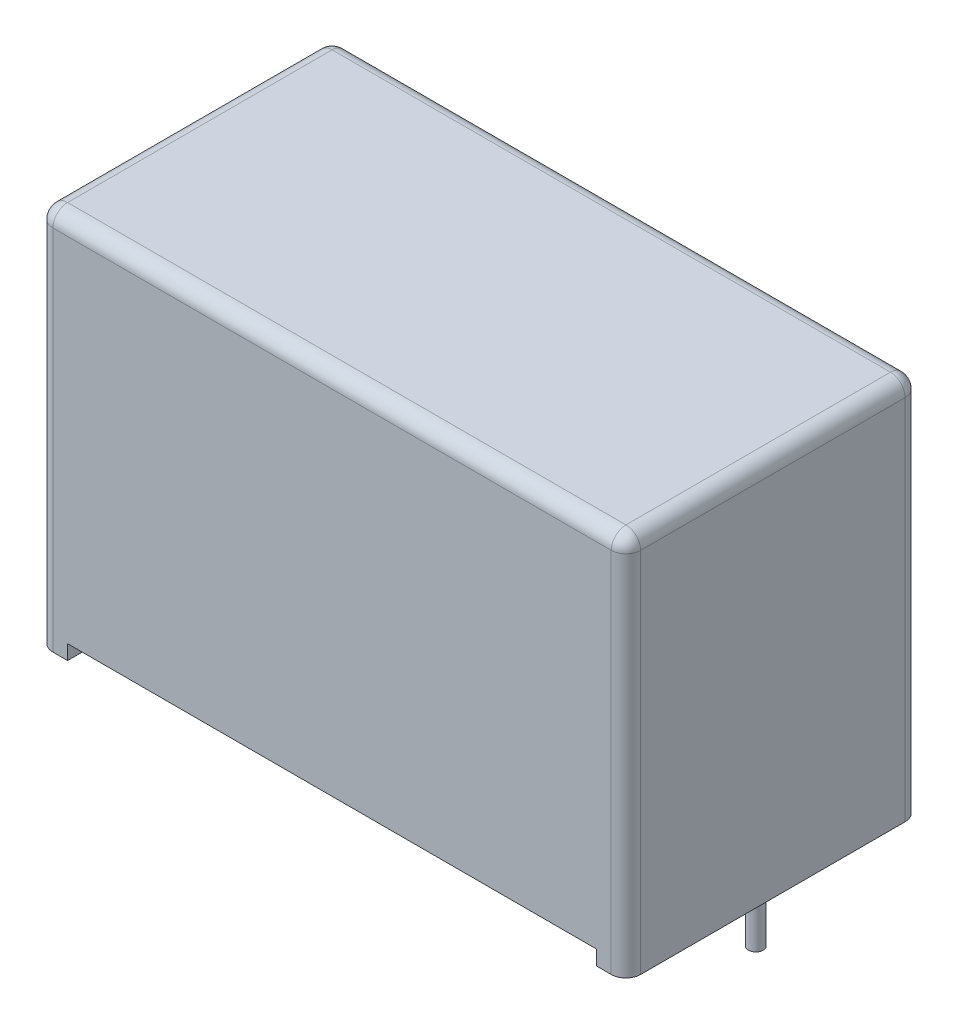
ISO-10303-21;
HEADER;
FILE_DESCRIPTION(('STEP AP214'),'2;1');
FILE_NAME('part.step','',(''),(''),'','','');
FILE_SCHEMA(('AUTOMOTIVE_DESIGN { 1 0 10303 214 1 1 1 1 }'));
ENDSEC;
DATA;
#1=APPLICATION_CONTEXT('core data for automotive mechanical design processes');
#2=APPLICATION_PROTOCOL_DEFINITION('international standard','automotive_design',2000,#1);
#3=PRODUCT_CONTEXT('',#1,'mechanical');
#4=PRODUCT('Part','Part','',(#3));
#5=PRODUCT_RELATED_PRODUCT_CATEGORY('part','',(#4));
#6=PRODUCT_DEFINITION_FORMATION('','',#4);
#7=PRODUCT_DEFINITION_CONTEXT('part definition',#1,'design');
#8=PRODUCT_DEFINITION('design','',#6,#7);
#9=PRODUCT_DEFINITION_SHAPE('','',#8);
#10=(LENGTH_UNIT() NAMED_UNIT(*) SI_UNIT(.MILLI.,.METRE.));
#11=(NAMED_UNIT(*) PLANE_ANGLE_UNIT() SI_UNIT($,.RADIAN.));
#12=(NAMED_UNIT(*) SI_UNIT($,.STERADIAN.) SOLID_ANGLE_UNIT());
#13=UNCERTAINTY_MEASURE_WITH_UNIT(LENGTH_MEASURE(1.E-05),#10,'distance_accuracy_value','');
#14=(GEOMETRIC_REPRESENTATION_CONTEXT(3) GLOBAL_UNCERTAINTY_ASSIGNED_CONTEXT((#13)) GLOBAL_UNIT_ASSIGNED_CONTEXT((#10,
#11,#12)) REPRESENTATION_CONTEXT('',''));
#15=CARTESIAN_POINT('',(0.,0.,0.));
#16=DIRECTION('',(0.,0.,1.));
#17=DIRECTION('',(1.,0.,0.));
#18=AXIS2_PLACEMENT_3D('',#15,#16,#17);
#19=CARTESIAN_POINT('',(2.539999850988,-3.5,-1.800000074506));
#20=DIRECTION('',(0.,-1.,0.));
#21=DIRECTION('',(0.,0.,-1.));
#22=AXIS2_PLACEMENT_3D('',#19,#20,#21);
#23=PLANE('',#22);
#24=CARTESIAN_POINT('',(2.539999850988,-3.5,-1.800000074506));
#25=DIRECTION('',(0.,-1.,0.));
#26=DIRECTION('',(0.,0.,-1.));
#27=AXIS2_PLACEMENT_3D('',#24,#25,#26);
#28=CIRCLE('',#27,0.25);
#29=CARTESIAN_POINT('',(2.539999850988,-3.5,-2.050000074506));
#30=VERTEX_POINT('',#29);
#31=EDGE_CURVE('P0_E18',#30,#30,#28,.F.);
#32=ORIENTED_EDGE('',*,*,#31,.F.);
#33=EDGE_LOOP('',(#32));
#34=FACE_BOUND('',#33,.T.);
#35=ADVANCED_FACE('P0_F15',(#34),#23,.T.);
#36=CARTESIAN_POINT('',(2.539999850988,0.5,-1.800000074506));
#37=DIRECTION('',(0.,-1.,0.));
#38=DIRECTION('',(0.,0.,-1.));
#39=AXIS2_PLACEMENT_3D('',#36,#37,#38);
#40=PLANE('',#39);
#41=CARTESIAN_POINT('',(2.539999850988,0.5,-1.800000074506));
#42=DIRECTION('',(0.,-1.,0.));
#43=DIRECTION('',(0.,0.,-1.));
#44=AXIS2_PLACEMENT_3D('',#41,#42,#43);
#45=CIRCLE('',#44,0.25);
#46=CARTESIAN_POINT('',(2.539999850988,0.5,-2.050000074506));
#47=VERTEX_POINT('',#46);
#48=EDGE_CURVE('P0_E10',#47,#47,#45,.T.);
#49=ORIENTED_EDGE('',*,*,#48,.F.);
#50=EDGE_LOOP('',(#49));
#51=FACE_BOUND('',#50,.T.);
#52=ADVANCED_FACE('P0_F30',(#51),#40,.F.);
#53=CARTESIAN_POINT('',(2.539999850988,0.5,-1.800000074506));
#54=DIRECTION('',(0.,-1.,0.));
#55=DIRECTION('',(0.,0.,-1.));
#56=AXIS2_PLACEMENT_3D('',#53,#54,#55);
#57=CYLINDRICAL_SURFACE('',#56,0.25);
#58=ORIENTED_EDGE('',*,*,#48,.T.);
#59=EDGE_LOOP('',(#58));
#60=FACE_BOUND('',#59,.T.);
#61=ORIENTED_EDGE('',*,*,#31,.T.);
#62=EDGE_LOOP('',(#61));
#63=FACE_BOUND('',#62,.T.);
#64=ADVANCED_FACE('P0_F27',(#60,#63),#57,.T.);
#65=CLOSED_SHELL('',(#35,#52,#64));
#66=MANIFOLD_SOLID_BREP('P0_B1',#65);
#67=CARTESIAN_POINT('',(-5.080000149012,-3.5,-1.800000074506));
#68=DIRECTION('',(0.,-1.,0.));
#69=DIRECTION('',(0.,0.,-1.));
#70=AXIS2_PLACEMENT_3D('',#67,#68,#69);
#71=PLANE('',#70);
#72=CARTESIAN_POINT('',(-5.080000149012,-3.5,-1.800000074506));
#73=DIRECTION('',(0.,-1.,0.));
#74=DIRECTION('',(0.,0.,-1.));
#75=AXIS2_PLACEMENT_3D('',#72,#73,#74);
#76=CIRCLE('',#75,0.25);
#77=CARTESIAN_POINT('',(-5.080000149012,-3.5,-2.050000074506));
#78=VERTEX_POINT('',#77);
#79=EDGE_CURVE('P1_E18',#78,#78,#76,.F.);
#80=ORIENTED_EDGE('',*,*,#79,.F.);
#81=EDGE_LOOP('',(#80));
#82=FACE_BOUND('',#81,.T.);
#83=ADVANCED_FACE('P1_F15',(#82),#71,.T.);
#84=CARTESIAN_POINT('',(-5.080000149012,0.5,-1.800000074506));
#85=DIRECTION('',(0.,-1.,0.));
#86=DIRECTION('',(0.,0.,-1.));
#87=AXIS2_PLACEMENT_3D('',#84,#85,#86);
#88=PLANE('',#87);
#89=CARTESIAN_POINT('',(-5.080000149012,0.5,-1.800000074506));
#90=DIRECTION('',(0.,-1.,0.));
#91=DIRECTION('',(0.,0.,-1.));
#92=AXIS2_PLACEMENT_3D('',#89,#90,#91);
#93=CIRCLE('',#92,0.25);
#94=CARTESIAN_POINT('',(-5.080000149012,0.5,-2.050000074506));
#95=VERTEX_POINT('',#94);
#96=EDGE_CURVE('P1_E10',#95,#95,#93,.T.);
#97=ORIENTED_EDGE('',*,*,#96,.F.);
#98=EDGE_LOOP('',(#97));
#99=FACE_BOUND('',#98,.T.);
#100=ADVANCED_FACE('P1_F30',(#99),#88,.F.);
#101=CARTESIAN_POINT('',(-5.080000149012,0.5,-1.800000074506));
#102=DIRECTION('',(0.,-1.,0.));
#103=DIRECTION('',(0.,0.,-1.));
#104=AXIS2_PLACEMENT_3D('',#101,#102,#103);
#105=CYLINDRICAL_SURFACE('',#104,0.25);
#106=ORIENTED_EDGE('',*,*,#96,.T.);
#107=EDGE_LOOP('',(#106));
#108=FACE_BOUND('',#107,.T.);
#109=ORIENTED_EDGE('',*,*,#79,.T.);
#110=EDGE_LOOP('',(#109));
#111=FACE_BOUND('',#110,.T.);
#112=ADVANCED_FACE('P1_F27',(#108,#111),#105,.T.);
#113=CLOSED_SHELL('',(#83,#100,#112));
#114=MANIFOLD_SOLID_BREP('P1_B1',#113);
#115=CARTESIAN_POINT('',(9.5,12.5,4.5));
#116=DIRECTION('',(0.577350269189626,0.577350269189626,0.577350269189626));
#117=DIRECTION('',(-0.707106781186548,0.,0.707106781186548));
#118=AXIS2_PLACEMENT_3D('',#115,#116,#117);
#119=SPHERICAL_SURFACE('',#118,0.5);
#120=CARTESIAN_POINT('',(9.78867513459481,12.7886751345948,4.78867513459481));
#121=VERTEX_POINT('',#120);
#122=VERTEX_LOOP('',#121);
#123=FACE_BOUND('',#122,.T.);
#124=CARTESIAN_POINT('',(9.5,12.5,4.5));
#125=DIRECTION('',(0.,1.,0.));
#126=DIRECTION('',(0.,0.,1.));
#127=AXIS2_PLACEMENT_3D('',#124,#125,#126);
#128=CIRCLE('',#127,0.5);
#129=CARTESIAN_POINT('',(10.,12.5,4.5));
#130=VERTEX_POINT('',#129);
#131=CARTESIAN_POINT('',(9.5,12.5,5.));
#132=VERTEX_POINT('',#131);
#133=EDGE_CURVE('P2_E146',#130,#132,#128,.F.);
#134=ORIENTED_EDGE('',*,*,#133,.F.);
#135=CARTESIAN_POINT('',(9.5,12.5,4.5));
#136=DIRECTION('',(0.,0.,-1.));
#137=DIRECTION('',(-1.,0.,0.));
#138=AXIS2_PLACEMENT_3D('',#135,#136,#137);
#139=CIRCLE('',#138,0.5);
#140=CARTESIAN_POINT('',(9.5,13.,4.5));
#141=VERTEX_POINT('',#140);
#142=EDGE_CURVE('P2_E136',#141,#130,#139,.T.);
#143=ORIENTED_EDGE('',*,*,#142,.F.);
#144=CARTESIAN_POINT('',(9.5,12.5,4.5));
#145=DIRECTION('',(1.,0.,0.));
#146=DIRECTION('',(0.,0.,-1.));
#147=AXIS2_PLACEMENT_3D('',#144,#145,#146);
#148=CIRCLE('',#147,0.5);
#149=EDGE_CURVE('P2_E298',#132,#141,#148,.F.);
#150=ORIENTED_EDGE('',*,*,#149,.F.);
#151=EDGE_LOOP('',(#134,#143,#150));
#152=FACE_BOUND('',#151,.T.);
#153=ADVANCED_FACE('P2_F17',(#123,#152),#119,.T.);
#154=CARTESIAN_POINT('',(-9.5,12.5,4.5));
#155=DIRECTION('',(-0.577350269189626,0.577350269189626,0.577350269189626));
#156=DIRECTION('',(-0.707106781186548,0.,-0.707106781186548));
#157=AXIS2_PLACEMENT_3D('',#154,#155,#156);
#158=SPHERICAL_SURFACE('',#157,0.5);
#159=CARTESIAN_POINT('',(-9.78867513459481,12.7886751345948,4.78867513459481));
#160=VERTEX_POINT('',#159);
#161=VERTEX_LOOP('',#160);
#162=FACE_BOUND('',#161,.T.);
#163=CARTESIAN_POINT('',(-9.5,12.5,4.5));
#164=DIRECTION('',(0.,1.,0.));
#165=DIRECTION('',(0.,0.,1.));
#166=AXIS2_PLACEMENT_3D('',#163,#164,#165);
#167=CIRCLE('',#166,0.5);
#168=CARTESIAN_POINT('',(-9.5,12.5,5.));
#169=VERTEX_POINT('',#168);
#170=CARTESIAN_POINT('',(-10.,12.5,4.5));
#171=VERTEX_POINT('',#170);
#172=EDGE_CURVE('P2_E129',#169,#171,#167,.F.);
#173=ORIENTED_EDGE('',*,*,#172,.F.);
#174=CARTESIAN_POINT('',(-9.5,12.5,4.5));
#175=DIRECTION('',(1.,0.,0.));
#176=DIRECTION('',(0.,0.,-1.));
#177=AXIS2_PLACEMENT_3D('',#174,#175,#176);
#178=CIRCLE('',#177,0.5);
#179=CARTESIAN_POINT('',(-9.5,13.,4.5));
#180=VERTEX_POINT('',#179);
#181=EDGE_CURVE('P2_E132',#180,#169,#178,.T.);
#182=ORIENTED_EDGE('',*,*,#181,.F.);
#183=CARTESIAN_POINT('',(-9.5,12.5,4.5));
#184=DIRECTION('',(0.,0.,1.));
#185=DIRECTION('',(1.,0.,0.));
#186=AXIS2_PLACEMENT_3D('',#183,#184,#185);
#187=CIRCLE('',#186,0.5);
#188=EDGE_CURVE('P2_E21',#171,#180,#187,.F.);
#189=ORIENTED_EDGE('',*,*,#188,.F.);
#190=EDGE_LOOP('',(#173,#182,#189));
#191=FACE_BOUND('',#190,.T.);
#192=ADVANCED_FACE('P2_F128',(#162,#191),#158,.T.);
#193=CARTESIAN_POINT('',(-9.5,12.5,-2.5));
#194=DIRECTION('',(0.,0.,1.));
#195=DIRECTION('',(1.,0.,0.));
#196=AXIS2_PLACEMENT_3D('',#193,#194,#195);
#197=CYLINDRICAL_SURFACE('',#196,0.5);
#198=CARTESIAN_POINT('',(-9.5,12.5,-4.5));
#199=DIRECTION('',(0.,0.,1.));
#200=DIRECTION('',(1.,0.,0.));
#201=AXIS2_PLACEMENT_3D('',#198,#199,#200);
#202=CIRCLE('',#201,0.5);
#203=CARTESIAN_POINT('',(-10.,12.5,-4.5));
#204=VERTEX_POINT('',#203);
#205=CARTESIAN_POINT('',(-9.5,13.,-4.5));
#206=VERTEX_POINT('',#205);
#207=EDGE_CURVE('P2_E153',#204,#206,#202,.F.);
#208=ORIENTED_EDGE('',*,*,#207,.F.);
#209=DIRECTION('',(0.,0.,1.));
#210=VECTOR('',#209,1.);
#211=CARTESIAN_POINT('',(-10.,12.5,-5.));
#212=LINE('',#211,#210);
#213=EDGE_CURVE('P2_E150',#171,#204,#212,.F.);
#214=ORIENTED_EDGE('',*,*,#213,.F.);
#215=ORIENTED_EDGE('',*,*,#188,.T.);
#216=DIRECTION('',(0.,0.,1.));
#217=VECTOR('',#216,1.);
#218=CARTESIAN_POINT('',(-9.5,13.,0.));
#219=LINE('',#218,#217);
#220=EDGE_CURVE('P2_E217',#206,#180,#219,.T.);
#221=ORIENTED_EDGE('',*,*,#220,.F.);
#222=EDGE_LOOP('',(#208,#214,#215,#221));
#223=FACE_BOUND('',#222,.T.);
#224=ADVANCED_FACE('P2_F151',(#223),#197,.T.);
#225=CARTESIAN_POINT('',(9.5,12.5,2.5));
#226=DIRECTION('',(0.,0.,-1.));
#227=DIRECTION('',(-1.,0.,0.));
#228=AXIS2_PLACEMENT_3D('',#225,#226,#227);
#229=CYLINDRICAL_SURFACE('',#228,0.5);
#230=ORIENTED_EDGE('',*,*,#142,.T.);
#231=DIRECTION('',(0.,0.,-1.));
#232=VECTOR('',#231,1.);
#233=CARTESIAN_POINT('',(10.,12.5,5.));
#234=LINE('',#233,#232);
#235=CARTESIAN_POINT('',(10.,12.5,-4.5));
#236=VERTEX_POINT('',#235);
#237=EDGE_CURVE('P2_E265',#236,#130,#234,.F.);
#238=ORIENTED_EDGE('',*,*,#237,.F.);
#239=CARTESIAN_POINT('',(9.5,12.5,-4.5));
#240=DIRECTION('',(0.,0.,-1.));
#241=DIRECTION('',(-1.,0.,0.));
#242=AXIS2_PLACEMENT_3D('',#239,#240,#241);
#243=CIRCLE('',#242,0.5);
#244=CARTESIAN_POINT('',(9.5,13.,-4.5));
#245=VERTEX_POINT('',#244);
#246=EDGE_CURVE('P2_E263',#245,#236,#243,.T.);
#247=ORIENTED_EDGE('',*,*,#246,.F.);
#248=DIRECTION('',(0.,0.,1.));
#249=VECTOR('',#248,1.);
#250=CARTESIAN_POINT('',(9.5,13.,0.));
#251=LINE('',#250,#249);
#252=EDGE_CURVE('P2_E282',#141,#245,#251,.F.);
#253=ORIENTED_EDGE('',*,*,#252,.F.);
#254=EDGE_LOOP('',(#230,#238,#247,#253));
#255=FACE_BOUND('',#254,.T.);
#256=ADVANCED_FACE('P2_F183',(#255),#229,.T.);
#257=CARTESIAN_POINT('',(0.,0.,0.));
#258=DIRECTION('',(0.,1.,0.));
#259=DIRECTION('',(0.,0.,1.));
#260=AXIS2_PLACEMENT_3D('',#257,#258,#259);
#261=PLANE('',#260);
#262=DIRECTION('',(0.,0.,1.));
#263=VECTOR('',#262,1.);
#264=CARTESIAN_POINT('',(-10.,0.,-5.));
#265=LINE('',#264,#263);
#266=CARTESIAN_POINT('',(-10.,0.,-4.5));
#267=VERTEX_POINT('',#266);
#268=CARTESIAN_POINT('',(-10.,0.,4.5));
#269=VERTEX_POINT('',#268);
#270=EDGE_CURVE('P2_E157',#267,#269,#265,.T.);
#271=ORIENTED_EDGE('',*,*,#270,.F.);
#272=CARTESIAN_POINT('',(-9.5,0.,-4.5));
#273=DIRECTION('',(0.,1.,0.));
#274=DIRECTION('',(0.,0.,1.));
#275=AXIS2_PLACEMENT_3D('',#272,#273,#274);
#276=CIRCLE('',#275,0.5);
#277=CARTESIAN_POINT('',(-9.5,0.,-5.));
#278=VERTEX_POINT('',#277);
#279=EDGE_CURVE('P2_E253',#278,#267,#276,.T.);
#280=ORIENTED_EDGE('',*,*,#279,.F.);
#281=DIRECTION('',(1.,0.,0.));
#282=VECTOR('',#281,1.);
#283=CARTESIAN_POINT('',(0.,0.,-5.));
#284=LINE('',#283,#282);
#285=CARTESIAN_POINT('',(-9.,0.,-5.));
#286=VERTEX_POINT('',#285);
#287=EDGE_CURVE('P2_E251',#286,#278,#284,.F.);
#288=ORIENTED_EDGE('',*,*,#287,.F.);
#289=DIRECTION('',(0.,0.,1.));
#290=VECTOR('',#289,1.);
#291=CARTESIAN_POINT('',(-9.,0.,-5.));
#292=LINE('',#291,#290);
#293=CARTESIAN_POINT('',(-9.,0.,5.));
#294=VERTEX_POINT('',#293);
#295=EDGE_CURVE('P2_E272',#286,#294,#292,.T.);
#296=ORIENTED_EDGE('',*,*,#295,.T.);
#297=DIRECTION('',(1.,0.,0.));
#298=VECTOR('',#297,1.);
#299=CARTESIAN_POINT('',(0.,0.,5.));
#300=LINE('',#299,#298);
#301=CARTESIAN_POINT('',(-9.5,0.,5.));
#302=VERTEX_POINT('',#301);
#303=EDGE_CURVE('P2_E254',#302,#294,#300,.T.);
#304=ORIENTED_EDGE('',*,*,#303,.F.);
#305=CARTESIAN_POINT('',(-9.5,0.,4.5));
#306=DIRECTION('',(0.,1.,0.));
#307=DIRECTION('',(0.,0.,1.));
#308=AXIS2_PLACEMENT_3D('',#305,#306,#307);
#309=CIRCLE('',#308,0.5);
#310=EDGE_CURVE('P2_E147',#269,#302,#309,.T.);
#311=ORIENTED_EDGE('',*,*,#310,.F.);
#312=EDGE_LOOP('',(#271,#280,#288,#296,#304,#311));
#313=FACE_BOUND('',#312,.T.);
#314=ADVANCED_FACE('P2_F186',(#313),#261,.F.);
#315=CARTESIAN_POINT('',(-9.5,0.,4.5));
#316=DIRECTION('',(0.,1.,0.));
#317=DIRECTION('',(0.,0.,1.));
#318=AXIS2_PLACEMENT_3D('',#315,#316,#317);
#319=CYLINDRICAL_SURFACE('',#318,0.5);
#320=ORIENTED_EDGE('',*,*,#172,.T.);
#321=DIRECTION('',(0.,1.,0.));
#322=VECTOR('',#321,1.);
#323=CARTESIAN_POINT('',(-10.,0.,4.5));
#324=LINE('',#323,#322);
#325=EDGE_CURVE('P2_E142',#269,#171,#324,.T.);
#326=ORIENTED_EDGE('',*,*,#325,.F.);
#327=ORIENTED_EDGE('',*,*,#310,.T.);
#328=DIRECTION('',(0.,1.,0.));
#329=VECTOR('',#328,1.);
#330=CARTESIAN_POINT('',(-9.5,0.,5.));
#331=LINE('',#330,#329);
#332=EDGE_CURVE('P2_E145',#169,#302,#331,.F.);
#333=ORIENTED_EDGE('',*,*,#332,.F.);
#334=EDGE_LOOP('',(#320,#326,#327,#333));
#335=FACE_BOUND('',#334,.T.);
#336=ADVANCED_FACE('P2_F139',(#335),#319,.T.);
#337=CARTESIAN_POINT('',(9.5,0.,4.5));
#338=DIRECTION('',(0.,1.,0.));
#339=DIRECTION('',(0.,0.,1.));
#340=AXIS2_PLACEMENT_3D('',#337,#338,#339);
#341=CYLINDRICAL_SURFACE('',#340,0.5);
#342=ORIENTED_EDGE('',*,*,#133,.T.);
#343=DIRECTION('',(0.,1.,0.));
#344=VECTOR('',#343,1.);
#345=CARTESIAN_POINT('',(9.5,0.,5.));
#346=LINE('',#345,#344);
#347=CARTESIAN_POINT('',(9.5,0.,5.));
#348=VERTEX_POINT('',#347);
#349=EDGE_CURVE('P2_E234',#348,#132,#346,.T.);
#350=ORIENTED_EDGE('',*,*,#349,.F.);
#351=CARTESIAN_POINT('',(9.5,0.,4.5));
#352=DIRECTION('',(0.,1.,0.));
#353=DIRECTION('',(0.,0.,1.));
#354=AXIS2_PLACEMENT_3D('',#351,#352,#353);
#355=CIRCLE('',#354,0.5);
#356=CARTESIAN_POINT('',(10.,0.,4.5));
#357=VERTEX_POINT('',#356);
#358=EDGE_CURVE('P2_E161',#348,#357,#355,.T.);
#359=ORIENTED_EDGE('',*,*,#358,.T.);
#360=DIRECTION('',(0.,1.,0.));
#361=VECTOR('',#360,1.);
#362=CARTESIAN_POINT('',(10.,0.,4.5));
#363=LINE('',#362,#361);
#364=EDGE_CURVE('P2_E260',#130,#357,#363,.F.);
#365=ORIENTED_EDGE('',*,*,#364,.F.);
#366=EDGE_LOOP('',(#342,#350,#359,#365));
#367=FACE_BOUND('',#366,.T.);
#368=ADVANCED_FACE('P2_F193',(#367),#341,.T.);
#369=CARTESIAN_POINT('',(-5.,12.5,4.5));
#370=DIRECTION('',(1.,0.,0.));
#371=DIRECTION('',(0.,0.,-1.));
#372=AXIS2_PLACEMENT_3D('',#369,#370,#371);
#373=CYLINDRICAL_SURFACE('',#372,0.5);
#374=ORIENTED_EDGE('',*,*,#181,.T.);
#375=DIRECTION('',(1.,0.,0.));
#376=VECTOR('',#375,1.);
#377=CARTESIAN_POINT('',(-10.,12.5,5.));
#378=LINE('',#377,#376);
#379=EDGE_CURVE('P2_E172',#132,#169,#378,.F.);
#380=ORIENTED_EDGE('',*,*,#379,.F.);
#381=ORIENTED_EDGE('',*,*,#149,.T.);
#382=DIRECTION('',(1.,0.,0.));
#383=VECTOR('',#382,1.);
#384=CARTESIAN_POINT('',(0.,13.,4.5));
#385=LINE('',#384,#383);
#386=EDGE_CURVE('P2_E167',#180,#141,#385,.T.);
#387=ORIENTED_EDGE('',*,*,#386,.F.);
#388=EDGE_LOOP('',(#374,#380,#381,#387));
#389=FACE_BOUND('',#388,.T.);
#390=ADVANCED_FACE('P2_F196',(#389),#373,.T.);
#391=CARTESIAN_POINT('',(0.,0.,0.));
#392=DIRECTION('',(0.,1.,0.));
#393=DIRECTION('',(0.,0.,1.));
#394=AXIS2_PLACEMENT_3D('',#391,#392,#393);
#395=PLANE('',#394);
#396=DIRECTION('',(1.,0.,0.));
#397=VECTOR('',#396,1.);
#398=CARTESIAN_POINT('',(-10.,0.,5.));
#399=LINE('',#398,#397);
#400=CARTESIAN_POINT('',(9.,0.,5.));
#401=VERTEX_POINT('',#400);
#402=EDGE_CURVE('P2_E237',#401,#348,#399,.T.);
#403=ORIENTED_EDGE('',*,*,#402,.F.);
#404=DIRECTION('',(0.,0.,-1.));
#405=VECTOR('',#404,1.);
#406=CARTESIAN_POINT('',(9.,0.,5.));
#407=LINE('',#406,#405);
#408=CARTESIAN_POINT('',(9.,0.,-5.));
#409=VERTEX_POINT('',#408);
#410=EDGE_CURVE('P2_E227',#401,#409,#407,.T.);
#411=ORIENTED_EDGE('',*,*,#410,.T.);
#412=DIRECTION('',(1.,0.,0.));
#413=VECTOR('',#412,1.);
#414=CARTESIAN_POINT('',(0.,0.,-5.));
#415=LINE('',#414,#413);
#416=CARTESIAN_POINT('',(9.5,0.,-5.));
#417=VERTEX_POINT('',#416);
#418=EDGE_CURVE('P2_E163',#417,#409,#415,.F.);
#419=ORIENTED_EDGE('',*,*,#418,.F.);
#420=CARTESIAN_POINT('',(9.5,0.,-4.5));
#421=DIRECTION('',(0.,1.,0.));
#422=DIRECTION('',(0.,0.,1.));
#423=AXIS2_PLACEMENT_3D('',#420,#421,#422);
#424=CIRCLE('',#423,0.5);
#425=CARTESIAN_POINT('',(10.,0.,-4.5));
#426=VERTEX_POINT('',#425);
#427=EDGE_CURVE('P2_E231',#426,#417,#424,.T.);
#428=ORIENTED_EDGE('',*,*,#427,.F.);
#429=DIRECTION('',(0.,0.,-1.));
#430=VECTOR('',#429,1.);
#431=CARTESIAN_POINT('',(10.,0.,5.));
#432=LINE('',#431,#430);
#433=EDGE_CURVE('P2_E262',#357,#426,#432,.T.);
#434=ORIENTED_EDGE('',*,*,#433,.F.);
#435=ORIENTED_EDGE('',*,*,#358,.F.);
#436=EDGE_LOOP('',(#403,#411,#419,#428,#434,#435));
#437=FACE_BOUND('',#436,.T.);
#438=ADVANCED_FACE('P2_F200',(#437),#395,.F.);
#439=CARTESIAN_POINT('',(-10.,0.,-5.));
#440=DIRECTION('',(-1.,0.,0.));
#441=DIRECTION('',(0.,0.,1.));
#442=AXIS2_PLACEMENT_3D('',#439,#440,#441);
#443=PLANE('',#442);
#444=DIRECTION('',(0.,1.,0.));
#445=VECTOR('',#444,1.);
#446=CARTESIAN_POINT('',(-10.,0.,-4.5));
#447=LINE('',#446,#445);
#448=EDGE_CURVE('P2_E224',#267,#204,#447,.T.);
#449=ORIENTED_EDGE('',*,*,#448,.F.);
#450=ORIENTED_EDGE('',*,*,#270,.T.);
#451=ORIENTED_EDGE('',*,*,#325,.T.);
#452=ORIENTED_EDGE('',*,*,#213,.T.);
#453=EDGE_LOOP('',(#449,#450,#451,#452));
#454=FACE_BOUND('',#453,.T.);
#455=ADVANCED_FACE('P2_F159',(#454),#443,.T.);
#456=CARTESIAN_POINT('',(-9.5,12.5,-4.5));
#457=DIRECTION('',(-0.577350269189626,0.577350269189626,-0.577350269189626));
#458=DIRECTION('',(0.707106781186548,0.,-0.707106781186548));
#459=AXIS2_PLACEMENT_3D('',#456,#457,#458);
#460=SPHERICAL_SURFACE('',#459,0.5);
#461=CARTESIAN_POINT('',(-9.78867513459481,12.7886751345948,-4.78867513459481));
#462=VERTEX_POINT('',#461);
#463=VERTEX_LOOP('',#462);
#464=FACE_BOUND('',#463,.T.);
#465=CARTESIAN_POINT('',(-9.5,12.5,-4.5));
#466=DIRECTION('',(0.,1.,0.));
#467=DIRECTION('',(0.,0.,1.));
#468=AXIS2_PLACEMENT_3D('',#465,#466,#467);
#469=CIRCLE('',#468,0.5);
#470=CARTESIAN_POINT('',(-9.5,12.5,-5.));
#471=VERTEX_POINT('',#470);
#472=EDGE_CURVE('P2_E226',#204,#471,#469,.F.);
#473=ORIENTED_EDGE('',*,*,#472,.F.);
#474=ORIENTED_EDGE('',*,*,#207,.T.);
#475=CARTESIAN_POINT('',(-9.5,12.5,-4.5));
#476=DIRECTION('',(-1.,0.,0.));
#477=DIRECTION('',(0.,0.,1.));
#478=AXIS2_PLACEMENT_3D('',#475,#476,#477);
#479=CIRCLE('',#478,0.5);
#480=EDGE_CURVE('P2_E281',#471,#206,#479,.F.);
#481=ORIENTED_EDGE('',*,*,#480,.F.);
#482=EDGE_LOOP('',(#473,#474,#481));
#483=FACE_BOUND('',#482,.T.);
#484=ADVANCED_FACE('P2_F207',(#464,#483),#460,.T.);
#485=CARTESIAN_POINT('',(0.,13.,0.));
#486=DIRECTION('',(0.,1.,0.));
#487=DIRECTION('',(0.,0.,1.));
#488=AXIS2_PLACEMENT_3D('',#485,#486,#487);
#489=PLANE('',#488);
#490=ORIENTED_EDGE('',*,*,#252,.T.);
#491=DIRECTION('',(-1.,0.,0.));
#492=VECTOR('',#491,1.);
#493=CARTESIAN_POINT('',(5.,13.,-4.5));
#494=LINE('',#493,#492);
#495=EDGE_CURVE('P2_E278',#206,#245,#494,.F.);
#496=ORIENTED_EDGE('',*,*,#495,.F.);
#497=ORIENTED_EDGE('',*,*,#220,.T.);
#498=ORIENTED_EDGE('',*,*,#386,.T.);
#499=EDGE_LOOP('',(#490,#496,#497,#498));
#500=FACE_BOUND('',#499,.T.);
#501=ADVANCED_FACE('P2_F211',(#500),#489,.T.);
#502=CARTESIAN_POINT('',(9.5,12.5,-4.5));
#503=DIRECTION('',(0.577350269189626,0.577350269189626,-0.577350269189626));
#504=DIRECTION('',(0.707106781186548,0.,0.707106781186548));
#505=AXIS2_PLACEMENT_3D('',#502,#503,#504);
#506=SPHERICAL_SURFACE('',#505,0.5);
#507=CARTESIAN_POINT('',(9.78867513459481,12.7886751345948,-4.78867513459481));
#508=VERTEX_POINT('',#507);
#509=VERTEX_LOOP('',#508);
#510=FACE_BOUND('',#509,.T.);
#511=CARTESIAN_POINT('',(9.5,12.5,-4.5));
#512=DIRECTION('',(0.,1.,0.));
#513=DIRECTION('',(0.,0.,1.));
#514=AXIS2_PLACEMENT_3D('',#511,#512,#513);
#515=CIRCLE('',#514,0.5);
#516=CARTESIAN_POINT('',(9.5,12.5,-5.));
#517=VERTEX_POINT('',#516);
#518=EDGE_CURVE('P2_E515',#517,#236,#515,.F.);
#519=ORIENTED_EDGE('',*,*,#518,.F.);
#520=CARTESIAN_POINT('',(9.5,12.5,-4.5));
#521=DIRECTION('',(-1.,0.,0.));
#522=DIRECTION('',(0.,0.,1.));
#523=AXIS2_PLACEMENT_3D('',#520,#521,#522);
#524=CIRCLE('',#523,0.5);
#525=EDGE_CURVE('P2_E280',#245,#517,#524,.T.);
#526=ORIENTED_EDGE('',*,*,#525,.F.);
#527=ORIENTED_EDGE('',*,*,#246,.T.);
#528=EDGE_LOOP('',(#519,#526,#527));
#529=FACE_BOUND('',#528,.T.);
#530=ADVANCED_FACE('P2_F316',(#510,#529),#506,.T.);
#531=CARTESIAN_POINT('',(10.,0.,5.));
#532=DIRECTION('',(1.,0.,0.));
#533=DIRECTION('',(0.,0.,-1.));
#534=AXIS2_PLACEMENT_3D('',#531,#532,#533);
#535=PLANE('',#534);
#536=DIRECTION('',(0.,1.,0.));
#537=VECTOR('',#536,1.);
#538=CARTESIAN_POINT('',(10.,0.,-4.5));
#539=LINE('',#538,#537);
#540=EDGE_CURVE('P2_E276',#236,#426,#539,.F.);
#541=ORIENTED_EDGE('',*,*,#540,.F.);
#542=ORIENTED_EDGE('',*,*,#237,.T.);
#543=ORIENTED_EDGE('',*,*,#364,.T.);
#544=ORIENTED_EDGE('',*,*,#433,.T.);
#545=EDGE_LOOP('',(#541,#542,#543,#544));
#546=FACE_BOUND('',#545,.T.);
#547=ADVANCED_FACE('P2_F312',(#546),#535,.T.);
#548=CARTESIAN_POINT('',(-9.,0.,-5.));
#549=DIRECTION('',(-1.,0.,0.));
#550=DIRECTION('',(0.,0.,1.));
#551=AXIS2_PLACEMENT_3D('',#548,#549,#550);
#552=PLANE('',#551);
#553=DIRECTION('',(0.,1.,0.));
#554=VECTOR('',#553,1.);
#555=CARTESIAN_POINT('',(-9.,0.,-5.));
#556=LINE('',#555,#554);
#557=CARTESIAN_POINT('',(-9.,0.5,-5.));
#558=VERTEX_POINT('',#557);
#559=EDGE_CURVE('P2_E36',#558,#286,#556,.F.);
#560=ORIENTED_EDGE('',*,*,#559,.F.);
#561=DIRECTION('',(0.,0.,1.));
#562=VECTOR('',#561,1.);
#563=CARTESIAN_POINT('',(-9.,0.5,0.));
#564=LINE('',#563,#562);
#565=CARTESIAN_POINT('',(-9.,0.5,5.));
#566=VERTEX_POINT('',#565);
#567=EDGE_CURVE('P2_E500',#558,#566,#564,.T.);
#568=ORIENTED_EDGE('',*,*,#567,.T.);
#569=DIRECTION('',(0.,1.,0.));
#570=VECTOR('',#569,1.);
#571=CARTESIAN_POINT('',(-9.,0.,5.));
#572=LINE('',#571,#570);
#573=EDGE_CURVE('P2_E240',#294,#566,#572,.T.);
#574=ORIENTED_EDGE('',*,*,#573,.F.);
#575=ORIENTED_EDGE('',*,*,#295,.F.);
#576=EDGE_LOOP('',(#560,#568,#574,#575));
#577=FACE_BOUND('',#576,.T.);
#578=ADVANCED_FACE('P2_F315',(#577),#552,.F.);
#579=CARTESIAN_POINT('',(-10.,0.,5.));
#580=DIRECTION('',(0.,0.,1.));
#581=DIRECTION('',(1.,0.,0.));
#582=AXIS2_PLACEMENT_3D('',#579,#580,#581);
#583=PLANE('',#582);
#584=ORIENTED_EDGE('',*,*,#349,.T.);
#585=ORIENTED_EDGE('',*,*,#379,.T.);
#586=ORIENTED_EDGE('',*,*,#332,.T.);
#587=ORIENTED_EDGE('',*,*,#303,.T.);
#588=ORIENTED_EDGE('',*,*,#573,.T.);
#589=DIRECTION('',(1.,0.,0.));
#590=VECTOR('',#589,1.);
#591=CARTESIAN_POINT('',(0.,0.5,5.));
#592=LINE('',#591,#590);
#593=CARTESIAN_POINT('',(9.,0.5,5.));
#594=VERTEX_POINT('',#593);
#595=EDGE_CURVE('P2_E498',#566,#594,#592,.T.);
#596=ORIENTED_EDGE('',*,*,#595,.T.);
#597=DIRECTION('',(0.,1.,0.));
#598=VECTOR('',#597,1.);
#599=CARTESIAN_POINT('',(9.,0.,5.));
#600=LINE('',#599,#598);
#601=EDGE_CURVE('P2_E171',#594,#401,#600,.F.);
#602=ORIENTED_EDGE('',*,*,#601,.T.);
#603=ORIENTED_EDGE('',*,*,#402,.T.);
#604=EDGE_LOOP('',(#584,#585,#586,#587,#588,#596,#602,#603));
#605=FACE_BOUND('',#604,.T.);
#606=ADVANCED_FACE('P2_F311',(#605),#583,.T.);
#607=CARTESIAN_POINT('',(9.,0.,5.));
#608=DIRECTION('',(1.,0.,0.));
#609=DIRECTION('',(0.,0.,-1.));
#610=AXIS2_PLACEMENT_3D('',#607,#608,#609);
#611=PLANE('',#610);
#612=ORIENTED_EDGE('',*,*,#601,.F.);
#613=DIRECTION('',(0.,0.,1.));
#614=VECTOR('',#613,1.);
#615=CARTESIAN_POINT('',(9.,0.5,0.));
#616=LINE('',#615,#614);
#617=CARTESIAN_POINT('',(9.,0.5,-5.));
#618=VERTEX_POINT('',#617);
#619=EDGE_CURVE('P2_E223',#594,#618,#616,.F.);
#620=ORIENTED_EDGE('',*,*,#619,.T.);
#621=DIRECTION('',(0.,1.,0.));
#622=VECTOR('',#621,1.);
#623=CARTESIAN_POINT('',(9.,0.,-5.));
#624=LINE('',#623,#622);
#625=EDGE_CURVE('P2_E169',#409,#618,#624,.T.);
#626=ORIENTED_EDGE('',*,*,#625,.F.);
#627=ORIENTED_EDGE('',*,*,#410,.F.);
#628=EDGE_LOOP('',(#612,#620,#626,#627));
#629=FACE_BOUND('',#628,.T.);
#630=ADVANCED_FACE('P2_F347',(#629),#611,.F.);
#631=CARTESIAN_POINT('',(-9.5,0.,-4.5));
#632=DIRECTION('',(0.,1.,0.));
#633=DIRECTION('',(0.,0.,1.));
#634=AXIS2_PLACEMENT_3D('',#631,#632,#633);
#635=CYLINDRICAL_SURFACE('',#634,0.5);
#636=ORIENTED_EDGE('',*,*,#472,.T.);
#637=DIRECTION('',(0.,1.,0.));
#638=VECTOR('',#637,1.);
#639=CARTESIAN_POINT('',(-9.5,0.,-5.));
#640=LINE('',#639,#638);
#641=EDGE_CURVE('P2_E219',#278,#471,#640,.T.);
#642=ORIENTED_EDGE('',*,*,#641,.F.);
#643=ORIENTED_EDGE('',*,*,#279,.T.);
#644=ORIENTED_EDGE('',*,*,#448,.T.);
#645=EDGE_LOOP('',(#636,#642,#643,#644));
#646=FACE_BOUND('',#645,.T.);
#647=ADVANCED_FACE('P2_F343',(#646),#635,.T.);
#648=CARTESIAN_POINT('',(5.,12.5,-4.5));
#649=DIRECTION('',(-1.,0.,0.));
#650=DIRECTION('',(0.,0.,1.));
#651=AXIS2_PLACEMENT_3D('',#648,#649,#650);
#652=CYLINDRICAL_SURFACE('',#651,0.5);
#653=ORIENTED_EDGE('',*,*,#525,.T.);
#654=DIRECTION('',(-1.,0.,0.));
#655=VECTOR('',#654,1.);
#656=CARTESIAN_POINT('',(10.,12.5,-5.));
#657=LINE('',#656,#655);
#658=EDGE_CURVE('P2_E222',#471,#517,#657,.F.);
#659=ORIENTED_EDGE('',*,*,#658,.F.);
#660=ORIENTED_EDGE('',*,*,#480,.T.);
#661=ORIENTED_EDGE('',*,*,#495,.T.);
#662=EDGE_LOOP('',(#653,#659,#660,#661));
#663=FACE_BOUND('',#662,.T.);
#664=ADVANCED_FACE('P2_F339',(#663),#652,.T.);
#665=CARTESIAN_POINT('',(9.5,0.,-4.5));
#666=DIRECTION('',(0.,1.,0.));
#667=DIRECTION('',(0.,0.,1.));
#668=AXIS2_PLACEMENT_3D('',#665,#666,#667);
#669=CYLINDRICAL_SURFACE('',#668,0.5);
#670=ORIENTED_EDGE('',*,*,#518,.T.);
#671=ORIENTED_EDGE('',*,*,#540,.T.);
#672=ORIENTED_EDGE('',*,*,#427,.T.);
#673=DIRECTION('',(0.,1.,0.));
#674=VECTOR('',#673,1.);
#675=CARTESIAN_POINT('',(9.5,0.,-5.));
#676=LINE('',#675,#674);
#677=EDGE_CURVE('P2_E27',#517,#417,#676,.F.);
#678=ORIENTED_EDGE('',*,*,#677,.F.);
#679=EDGE_LOOP('',(#670,#671,#672,#678));
#680=FACE_BOUND('',#679,.T.);
#681=ADVANCED_FACE('P2_F333',(#680),#669,.T.);
#682=CARTESIAN_POINT('',(0.,0.5,0.));
#683=DIRECTION('',(0.,1.,0.));
#684=DIRECTION('',(0.,0.,1.));
#685=AXIS2_PLACEMENT_3D('',#682,#683,#684);
#686=PLANE('',#685);
#687=ORIENTED_EDGE('',*,*,#595,.F.);
#688=ORIENTED_EDGE('',*,*,#567,.F.);
#689=DIRECTION('',(-1.,0.,0.));
#690=VECTOR('',#689,1.);
#691=CARTESIAN_POINT('',(10.,0.5,-5.));
#692=LINE('',#691,#690);
#693=EDGE_CURVE('P2_E11',#618,#558,#692,.T.);
#694=ORIENTED_EDGE('',*,*,#693,.F.);
#695=ORIENTED_EDGE('',*,*,#619,.F.);
#696=EDGE_LOOP('',(#687,#688,#694,#695));
#697=FACE_BOUND('',#696,.T.);
#698=ADVANCED_FACE('P2_F327',(#697),#686,.F.);
#699=CARTESIAN_POINT('',(10.,0.,-5.));
#700=DIRECTION('',(0.,0.,-1.));
#701=DIRECTION('',(-1.,0.,0.));
#702=AXIS2_PLACEMENT_3D('',#699,#700,#701);
#703=PLANE('',#702);
#704=ORIENTED_EDGE('',*,*,#559,.T.);
#705=ORIENTED_EDGE('',*,*,#287,.T.);
#706=ORIENTED_EDGE('',*,*,#641,.T.);
#707=ORIENTED_EDGE('',*,*,#658,.T.);
#708=ORIENTED_EDGE('',*,*,#677,.T.);
#709=ORIENTED_EDGE('',*,*,#418,.T.);
#710=ORIENTED_EDGE('',*,*,#625,.T.);
#711=ORIENTED_EDGE('',*,*,#693,.T.);
#712=EDGE_LOOP('',(#704,#705,#706,#707,#708,#709,#710,#711));
#713=FACE_BOUND('',#712,.T.);
#714=ADVANCED_FACE('P2_F325',(#713),#703,.T.);
#715=CLOSED_SHELL('',(#153,#192,#224,#256,#314,#336,#368,#390,#438,#455,#484,#501,#530,#547,
#578,#606,#630,#647,#664,#681,#698,#714));
#716=MANIFOLD_SOLID_BREP('P2_B1',#715);
#717=CARTESIAN_POINT('',(7.619999850988,-3.5,-1.800000074506));
#718=DIRECTION('',(0.,-1.,0.));
#719=DIRECTION('',(0.,0.,-1.));
#720=AXIS2_PLACEMENT_3D('',#717,#718,#719);
#721=PLANE('',#720);
#722=CARTESIAN_POINT('',(7.619999850988,-3.5,-1.800000074506));
#723=DIRECTION('',(0.,-1.,0.));
#724=DIRECTION('',(0.,0.,-1.));
#725=AXIS2_PLACEMENT_3D('',#722,#723,#724);
#726=CIRCLE('',#725,0.25);
#727=CARTESIAN_POINT('',(7.619999850988,-3.5,-2.050000074506));
#728=VERTEX_POINT('',#727);
#729=EDGE_CURVE('P3_E18',#728,#728,#726,.F.);
#730=ORIENTED_EDGE('',*,*,#729,.F.);
#731=EDGE_LOOP('',(#730));
#732=FACE_BOUND('',#731,.T.);
#733=ADVANCED_FACE('P3_F15',(#732),#721,.T.);
#734=CARTESIAN_POINT('',(7.619999850988,0.5,-1.800000074506));
#735=DIRECTION('',(0.,-1.,0.));
#736=DIRECTION('',(0.,0.,-1.));
#737=AXIS2_PLACEMENT_3D('',#734,#735,#736);
#738=PLANE('',#737);
#739=CARTESIAN_POINT('',(7.619999850988,0.5,-1.800000074506));
#740=DIRECTION('',(0.,-1.,0.));
#741=DIRECTION('',(0.,0.,-1.));
#742=AXIS2_PLACEMENT_3D('',#739,#740,#741);
#743=CIRCLE('',#742,0.25);
#744=CARTESIAN_POINT('',(7.619999850988,0.5,-2.050000074506));
#745=VERTEX_POINT('',#744);
#746=EDGE_CURVE('P3_E10',#745,#745,#743,.T.);
#747=ORIENTED_EDGE('',*,*,#746,.F.);
#748=EDGE_LOOP('',(#747));
#749=FACE_BOUND('',#748,.T.);
#750=ADVANCED_FACE('P3_F30',(#749),#738,.F.);
#751=CARTESIAN_POINT('',(7.619999850988,0.5,-1.800000074506));
#752=DIRECTION('',(0.,-1.,0.));
#753=DIRECTION('',(0.,0.,-1.));
#754=AXIS2_PLACEMENT_3D('',#751,#752,#753);
#755=CYLINDRICAL_SURFACE('',#754,0.25);
#756=ORIENTED_EDGE('',*,*,#746,.T.);
#757=EDGE_LOOP('',(#756));
#758=FACE_BOUND('',#757,.T.);
#759=ORIENTED_EDGE('',*,*,#729,.T.);
#760=EDGE_LOOP('',(#759));
#761=FACE_BOUND('',#760,.T.);
#762=ADVANCED_FACE('P3_F27',(#758,#761),#755,.T.);
#763=CLOSED_SHELL('',(#733,#750,#762));
#764=MANIFOLD_SOLID_BREP('P3_B1',#763);
#765=CARTESIAN_POINT('',(-7.620000149012,-3.5,-1.800000074506));
#766=DIRECTION('',(0.,-1.,0.));
#767=DIRECTION('',(0.,0.,-1.));
#768=AXIS2_PLACEMENT_3D('',#765,#766,#767);
#769=PLANE('',#768);
#770=CARTESIAN_POINT('',(-7.620000149012,-3.5,-1.800000074506));
#771=DIRECTION('',(0.,-1.,0.));
#772=DIRECTION('',(0.,0.,-1.));
#773=AXIS2_PLACEMENT_3D('',#770,#771,#772);
#774=CIRCLE('',#773,0.25);
#775=CARTESIAN_POINT('',(-7.620000149012,-3.5,-2.050000074506));
#776=VERTEX_POINT('',#775);
#777=EDGE_CURVE('P4_E18',#776,#776,#774,.F.);
#778=ORIENTED_EDGE('',*,*,#777,.F.);
#779=EDGE_LOOP('',(#778));
#780=FACE_BOUND('',#779,.T.);
#781=ADVANCED_FACE('P4_F15',(#780),#769,.T.);
#782=CARTESIAN_POINT('',(-7.620000149012,0.5,-1.800000074506));
#783=DIRECTION('',(0.,-1.,0.));
#784=DIRECTION('',(0.,0.,-1.));
#785=AXIS2_PLACEMENT_3D('',#782,#783,#784);
#786=PLANE('',#785);
#787=CARTESIAN_POINT('',(-7.620000149012,0.5,-1.800000074506));
#788=DIRECTION('',(0.,-1.,0.));
#789=DIRECTION('',(0.,0.,-1.));
#790=AXIS2_PLACEMENT_3D('',#787,#788,#789);
#791=CIRCLE('',#790,0.25);
#792=CARTESIAN_POINT('',(-7.620000149012,0.5,-2.050000074506));
#793=VERTEX_POINT('',#792);
#794=EDGE_CURVE('P4_E10',#793,#793,#791,.T.);
#795=ORIENTED_EDGE('',*,*,#794,.F.);
#796=EDGE_LOOP('',(#795));
#797=FACE_BOUND('',#796,.T.);
#798=ADVANCED_FACE('P4_F30',(#797),#786,.F.);
#799=CARTESIAN_POINT('',(-7.620000149012,0.5,-1.800000074506));
#800=DIRECTION('',(0.,-1.,0.));
#801=DIRECTION('',(0.,0.,-1.));
#802=AXIS2_PLACEMENT_3D('',#799,#800,#801);
#803=CYLINDRICAL_SURFACE('',#802,0.25);
#804=ORIENTED_EDGE('',*,*,#794,.T.);
#805=EDGE_LOOP('',(#804));
#806=FACE_BOUND('',#805,.T.);
#807=ORIENTED_EDGE('',*,*,#777,.T.);
#808=EDGE_LOOP('',(#807));
#809=FACE_BOUND('',#808,.T.);
#810=ADVANCED_FACE('P4_F27',(#806,#809),#803,.T.);
#811=CLOSED_SHELL('',(#781,#798,#810));
#812=MANIFOLD_SOLID_BREP('P4_B1',#811);
#813=CARTESIAN_POINT('',(5.079999850988,-3.5,-1.800000074506));
#814=DIRECTION('',(0.,-1.,0.));
#815=DIRECTION('',(0.,0.,-1.));
#816=AXIS2_PLACEMENT_3D('',#813,#814,#815);
#817=PLANE('',#816);
#818=CARTESIAN_POINT('',(5.079999850988,-3.5,-1.800000074506));
#819=DIRECTION('',(0.,-1.,0.));
#820=DIRECTION('',(0.,0.,-1.));
#821=AXIS2_PLACEMENT_3D('',#818,#819,#820);
#822=CIRCLE('',#821,0.25);
#823=CARTESIAN_POINT('',(5.079999850988,-3.5,-2.050000074506));
#824=VERTEX_POINT('',#823);
#825=EDGE_CURVE('P5_E18',#824,#824,#822,.F.);
#826=ORIENTED_EDGE('',*,*,#825,.F.);
#827=EDGE_LOOP('',(#826));
#828=FACE_BOUND('',#827,.T.);
#829=ADVANCED_FACE('P5_F15',(#828),#817,.T.);
#830=CARTESIAN_POINT('',(5.079999850988,0.5,-1.800000074506));
#831=DIRECTION('',(0.,-1.,0.));
#832=DIRECTION('',(0.,0.,-1.));
#833=AXIS2_PLACEMENT_3D('',#830,#831,#832);
#834=PLANE('',#833);
#835=CARTESIAN_POINT('',(5.079999850988,0.5,-1.800000074506));
#836=DIRECTION('',(0.,-1.,0.));
#837=DIRECTION('',(0.,0.,-1.));
#838=AXIS2_PLACEMENT_3D('',#835,#836,#837);
#839=CIRCLE('',#838,0.25);
#840=CARTESIAN_POINT('',(5.079999850988,0.5,-2.050000074506));
#841=VERTEX_POINT('',#840);
#842=EDGE_CURVE('P5_E10',#841,#841,#839,.T.);
#843=ORIENTED_EDGE('',*,*,#842,.F.);
#844=EDGE_LOOP('',(#843));
#845=FACE_BOUND('',#844,.T.);
#846=ADVANCED_FACE('P5_F30',(#845),#834,.F.);
#847=CARTESIAN_POINT('',(5.079999850988,0.5,-1.800000074506));
#848=DIRECTION('',(0.,-1.,0.));
#849=DIRECTION('',(0.,0.,-1.));
#850=AXIS2_PLACEMENT_3D('',#847,#848,#849);
#851=CYLINDRICAL_SURFACE('',#850,0.25);
#852=ORIENTED_EDGE('',*,*,#842,.T.);
#853=EDGE_LOOP('',(#852));
#854=FACE_BOUND('',#853,.T.);
#855=ORIENTED_EDGE('',*,*,#825,.T.);
#856=EDGE_LOOP('',(#855));
#857=FACE_BOUND('',#856,.T.);
#858=ADVANCED_FACE('P5_F27',(#854,#857),#851,.T.);
#859=CLOSED_SHELL('',(#829,#846,#858));
#860=MANIFOLD_SOLID_BREP('P5_B1',#859);
#861=ADVANCED_BREP_SHAPE_REPRESENTATION('',(#18,#66,#114,#716,#764,#812,#860),#14);
#862=SHAPE_DEFINITION_REPRESENTATION(#9,#861);
ENDSEC;
END-ISO-10303-21;
